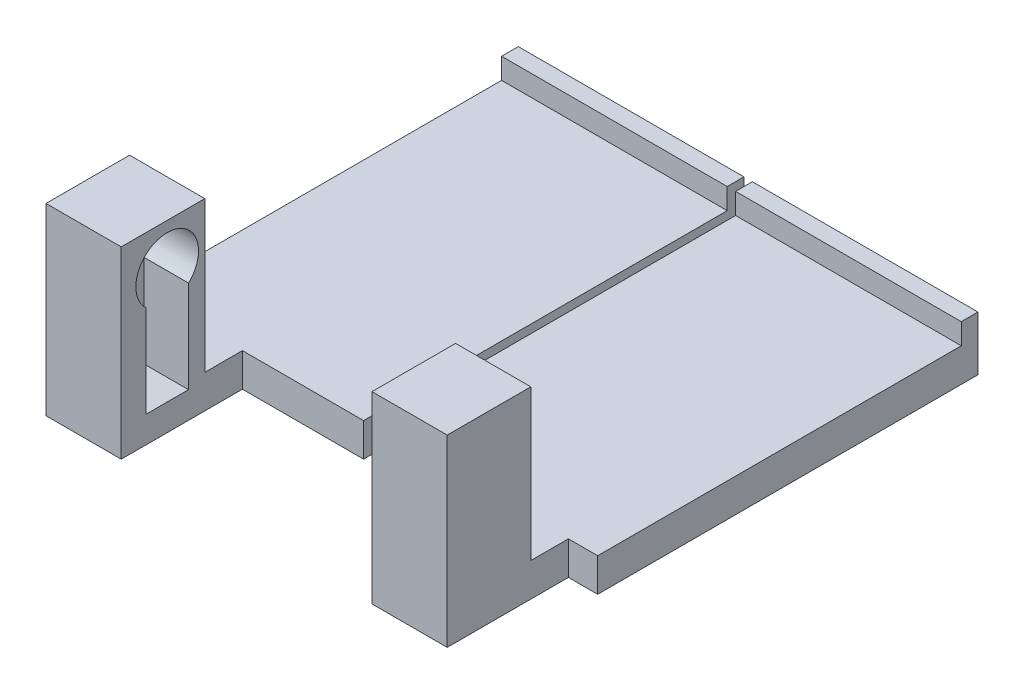
ISO-10303-21;
HEADER;
FILE_DESCRIPTION(('STEP AP214'),'2;1');
FILE_NAME('part.step','',(''),(''),'','','');
FILE_SCHEMA(('AUTOMOTIVE_DESIGN { 1 0 10303 214 1 1 1 1 }'));
ENDSEC;
DATA;
#1=APPLICATION_CONTEXT('core data for automotive mechanical design processes');
#2=APPLICATION_PROTOCOL_DEFINITION('international standard','automotive_design',2000,#1);
#3=PRODUCT_CONTEXT('',#1,'mechanical');
#4=PRODUCT('Part','Part','',(#3));
#5=PRODUCT_RELATED_PRODUCT_CATEGORY('part','',(#4));
#6=PRODUCT_DEFINITION_FORMATION('','',#4);
#7=PRODUCT_DEFINITION_CONTEXT('part definition',#1,'design');
#8=PRODUCT_DEFINITION('design','',#6,#7);
#9=PRODUCT_DEFINITION_SHAPE('','',#8);
#10=(LENGTH_UNIT() NAMED_UNIT(*) SI_UNIT(.MILLI.,.METRE.));
#11=(NAMED_UNIT(*) PLANE_ANGLE_UNIT() SI_UNIT($,.RADIAN.));
#12=(NAMED_UNIT(*) SI_UNIT($,.STERADIAN.) SOLID_ANGLE_UNIT());
#13=UNCERTAINTY_MEASURE_WITH_UNIT(LENGTH_MEASURE(1.E-05),#10,'distance_accuracy_value','');
#14=(GEOMETRIC_REPRESENTATION_CONTEXT(3) GLOBAL_UNCERTAINTY_ASSIGNED_CONTEXT((#13)) GLOBAL_UNIT_ASSIGNED_CONTEXT((#10,
#11,#12)) REPRESENTATION_CONTEXT('',''));
#15=CARTESIAN_POINT('',(0.,0.,0.));
#16=DIRECTION('',(0.,0.,1.));
#17=DIRECTION('',(1.,0.,0.));
#18=AXIS2_PLACEMENT_3D('',#15,#16,#17);
#19=CARTESIAN_POINT('',(-39.,-12.9782895512753,3.5));
#20=DIRECTION('',(0.,1.,0.));
#21=DIRECTION('',(0.,0.,1.));
#22=AXIS2_PLACEMENT_3D('',#19,#20,#21);
#23=PLANE('',#22);
#24=DIRECTION('',(0.,0.,-1.));
#25=VECTOR('',#24,1.);
#26=CARTESIAN_POINT('',(-42.5,-12.9782895512753,0.));
#27=LINE('',#26,#25);
#28=CARTESIAN_POINT('',(-42.5,-12.9782895512753,-11.));
#29=VERTEX_POINT('',#28);
#30=CARTESIAN_POINT('',(-42.5,-12.9782895512753,-54.5));
#31=VERTEX_POINT('',#30);
#32=EDGE_CURVE('E234',#29,#31,#27,.T.);
#33=ORIENTED_EDGE('',*,*,#32,.F.);
#34=DIRECTION('',(-1.,0.,0.));
#35=VECTOR('',#34,1.);
#36=CARTESIAN_POINT('',(-15.5,-12.9782895512753,-11.));
#37=LINE('',#36,#35);
#38=CARTESIAN_POINT('',(-39.,-12.9782895512753,-11.));
#39=VERTEX_POINT('',#38);
#40=EDGE_CURVE('E249',#39,#29,#37,.T.);
#41=ORIENTED_EDGE('',*,*,#40,.F.);
#42=DIRECTION('',(0.,0.,-1.));
#43=VECTOR('',#42,1.);
#44=CARTESIAN_POINT('',(-39.,-12.9782895512753,3.5));
#45=LINE('',#44,#43);
#46=CARTESIAN_POINT('',(-39.,-12.9782895512753,-6.5));
#47=VERTEX_POINT('',#46);
#48=EDGE_CURVE('E308',#47,#39,#45,.T.);
#49=ORIENTED_EDGE('',*,*,#48,.F.);
#50=DIRECTION('',(1.,0.,0.));
#51=VECTOR('',#50,1.);
#52=CARTESIAN_POINT('',(-39.,-12.9782895512753,-6.5));
#53=LINE('',#52,#51);
#54=CARTESIAN_POINT('',(-30.,-12.9782895512753,-6.5));
#55=VERTEX_POINT('',#54);
#56=EDGE_CURVE('E98',#47,#55,#53,.T.);
#57=ORIENTED_EDGE('',*,*,#56,.T.);
#58=DIRECTION('',(0.,0.,-1.));
#59=VECTOR('',#58,1.);
#60=CARTESIAN_POINT('',(-30.,-12.9782895512753,3.5));
#61=LINE('',#60,#59);
#62=CARTESIAN_POINT('',(-30.,-12.9782895512753,-11.));
#63=VERTEX_POINT('',#62);
#64=EDGE_CURVE('E286',#55,#63,#61,.T.);
#65=ORIENTED_EDGE('',*,*,#64,.T.);
#66=CARTESIAN_POINT('',(-15.5,-12.9782895512753,-11.));
#67=VERTEX_POINT('',#66);
#68=EDGE_CURVE('E245',#67,#63,#37,.T.);
#69=ORIENTED_EDGE('',*,*,#68,.F.);
#70=DIRECTION('',(0.,0.,-1.));
#71=VECTOR('',#70,1.);
#72=CARTESIAN_POINT('',(-15.5,-12.9782895512753,0.));
#73=LINE('',#72,#71);
#74=CARTESIAN_POINT('',(-15.5,-12.9782895512753,-54.5));
#75=VERTEX_POINT('',#74);
#76=EDGE_CURVE('E242',#67,#75,#73,.T.);
#77=ORIENTED_EDGE('',*,*,#76,.T.);
#78=DIRECTION('',(-1.,0.,0.));
#79=VECTOR('',#78,1.);
#80=CARTESIAN_POINT('',(-15.5,-12.9782895512753,-54.5));
#81=LINE('',#80,#79);
#82=EDGE_CURVE('E213',#75,#31,#81,.T.);
#83=ORIENTED_EDGE('',*,*,#82,.T.);
#84=EDGE_LOOP('',(#33,#41,#49,#57,#65,#69,#77,#83));
#85=FACE_BOUND('',#84,.T.);
#86=ADVANCED_FACE('F90',(#85),#23,.T.);
#87=CARTESIAN_POINT('',(-39.,0.,0.));
#88=DIRECTION('',(-1.,0.,0.));
#89=DIRECTION('',(0.,0.,-1.));
#90=AXIS2_PLACEMENT_3D('',#87,#88,#89);
#91=PLANE('',#90);
#92=DIRECTION('',(0.,0.,-1.));
#93=VECTOR('',#92,1.);
#94=CARTESIAN_POINT('',(-39.,5.02171044872466,3.5));
#95=LINE('',#94,#93);
#96=CARTESIAN_POINT('',(-39.,5.02171044872466,3.5));
#97=VERTEX_POINT('',#96);
#98=CARTESIAN_POINT('',(-39.,5.02171044872466,-6.5));
#99=VERTEX_POINT('',#98);
#100=EDGE_CURVE('E287',#97,#99,#95,.T.);
#101=ORIENTED_EDGE('',*,*,#100,.T.);
#102=DIRECTION('',(0.,1.,0.));
#103=VECTOR('',#102,1.);
#104=CARTESIAN_POINT('',(-39.,-12.9782895512753,-6.5));
#105=LINE('',#104,#103);
#106=EDGE_CURVE('E290',#47,#99,#105,.T.);
#107=ORIENTED_EDGE('',*,*,#106,.F.);
#108=ORIENTED_EDGE('',*,*,#48,.T.);
#109=DIRECTION('',(0.,1.,0.));
#110=VECTOR('',#109,1.);
#111=CARTESIAN_POINT('',(-39.,-16.9782895512753,-11.));
#112=LINE('',#111,#110);
#113=CARTESIAN_POINT('',(-39.,-16.9782895512753,-11.));
#114=VERTEX_POINT('',#113);
#115=EDGE_CURVE('E311',#114,#39,#112,.T.);
#116=ORIENTED_EDGE('',*,*,#115,.F.);
#117=DIRECTION('',(0.,0.,-1.));
#118=VECTOR('',#117,1.);
#119=CARTESIAN_POINT('',(-39.,-16.9782895512753,3.5));
#120=LINE('',#119,#118);
#121=CARTESIAN_POINT('',(-39.,-16.9782895512753,3.5));
#122=VERTEX_POINT('',#121);
#123=EDGE_CURVE('E314',#122,#114,#120,.T.);
#124=ORIENTED_EDGE('',*,*,#123,.F.);
#125=DIRECTION('',(0.,1.,0.));
#126=VECTOR('',#125,1.);
#127=CARTESIAN_POINT('',(-39.,-12.9782895512753,3.5));
#128=LINE('',#127,#126);
#129=EDGE_CURVE('E294',#122,#97,#128,.T.);
#130=ORIENTED_EDGE('',*,*,#129,.T.);
#131=EDGE_LOOP('',(#101,#107,#108,#116,#124,#130));
#132=FACE_BOUND('',#131,.T.);
#133=ADVANCED_FACE('F350',(#132),#91,.T.);
#134=CARTESIAN_POINT('',(-39.,5.02171044872466,3.5));
#135=DIRECTION('',(0.,1.,0.));
#136=DIRECTION('',(0.,0.,1.));
#137=AXIS2_PLACEMENT_3D('',#134,#135,#136);
#138=PLANE('',#137);
#139=DIRECTION('',(0.,0.,-1.));
#140=VECTOR('',#139,1.);
#141=CARTESIAN_POINT('',(-30.,5.02171044872466,3.5));
#142=LINE('',#141,#140);
#143=CARTESIAN_POINT('',(-30.,5.02171044872466,3.5));
#144=VERTEX_POINT('',#143);
#145=CARTESIAN_POINT('',(-30.,5.02171044872466,-6.5));
#146=VERTEX_POINT('',#145);
#147=EDGE_CURVE('E298',#144,#146,#142,.T.);
#148=ORIENTED_EDGE('',*,*,#147,.T.);
#149=DIRECTION('',(1.,0.,0.));
#150=VECTOR('',#149,1.);
#151=CARTESIAN_POINT('',(-39.,5.02171044872466,-6.5));
#152=LINE('',#151,#150);
#153=EDGE_CURVE('E297',#99,#146,#152,.T.);
#154=ORIENTED_EDGE('',*,*,#153,.F.);
#155=ORIENTED_EDGE('',*,*,#100,.F.);
#156=DIRECTION('',(1.,0.,0.));
#157=VECTOR('',#156,1.);
#158=CARTESIAN_POINT('',(-39.,5.02171044872466,3.5));
#159=LINE('',#158,#157);
#160=EDGE_CURVE('E13',#97,#144,#159,.T.);
#161=ORIENTED_EDGE('',*,*,#160,.T.);
#162=EDGE_LOOP('',(#148,#154,#155,#161));
#163=FACE_BOUND('',#162,.T.);
#164=ADVANCED_FACE('F345',(#163),#138,.T.);
#165=CARTESIAN_POINT('',(-30.,0.,0.));
#166=DIRECTION('',(-1.,0.,0.));
#167=DIRECTION('',(0.,0.,-1.));
#168=AXIS2_PLACEMENT_3D('',#165,#166,#167);
#169=PLANE('',#168);
#170=DIRECTION('',(0.,0.,1.));
#171=VECTOR('',#170,1.);
#172=CARTESIAN_POINT('',(-30.,-13.8,-4.55000000000001));
#173=LINE('',#172,#171);
#174=CARTESIAN_POINT('',(-30.,-13.8,-4.55000000000001));
#175=VERTEX_POINT('',#174);
#176=CARTESIAN_POINT('',(-30.,-13.8,0.549999999999994));
#177=VERTEX_POINT('',#176);
#178=EDGE_CURVE('E276',#175,#177,#173,.T.);
#179=ORIENTED_EDGE('',*,*,#178,.T.);
#180=DIRECTION('',(0.,-1.,0.));
#181=VECTOR('',#180,1.);
#182=CARTESIAN_POINT('',(-30.,0.,0.549999999999999));
#183=LINE('',#182,#181);
#184=CARTESIAN_POINT('',(-30.,-2.7495454169735,0.549999999999998));
#185=VERTEX_POINT('',#184);
#186=EDGE_CURVE('E248',#185,#177,#183,.T.);
#187=ORIENTED_EDGE('',*,*,#186,.F.);
#188=CARTESIAN_POINT('',(-30.,0.,-2.));
#189=DIRECTION('',(1.,0.,0.));
#190=DIRECTION('',(0.,0.,-1.));
#191=AXIS2_PLACEMENT_3D('',#188,#189,#190);
#192=CIRCLE('',#191,3.75);
#193=CARTESIAN_POINT('',(-30.,-2.7495454169735,-4.55));
#194=VERTEX_POINT('',#193);
#195=EDGE_CURVE('E259',#194,#185,#192,.T.);
#196=ORIENTED_EDGE('',*,*,#195,.F.);
#197=DIRECTION('',(0.,-1.,0.));
#198=VECTOR('',#197,1.);
#199=CARTESIAN_POINT('',(-30.,0.,-4.55));
#200=LINE('',#199,#198);
#201=EDGE_CURVE('E267',#194,#175,#200,.T.);
#202=ORIENTED_EDGE('',*,*,#201,.T.);
#203=EDGE_LOOP('',(#179,#187,#196,#202));
#204=FACE_BOUND('',#203,.T.);
#205=ORIENTED_EDGE('',*,*,#147,.F.);
#206=DIRECTION('',(0.,1.,0.));
#207=VECTOR('',#206,1.);
#208=CARTESIAN_POINT('',(-30.,-12.9782895512753,3.5));
#209=LINE('',#208,#207);
#210=CARTESIAN_POINT('',(-30.,-16.9782895512753,3.5));
#211=VERTEX_POINT('',#210);
#212=EDGE_CURVE('E291',#211,#144,#209,.T.);
#213=ORIENTED_EDGE('',*,*,#212,.F.);
#214=DIRECTION('',(0.,0.,-1.));
#215=VECTOR('',#214,1.);
#216=CARTESIAN_POINT('',(-30.,-16.9782895512753,3.5));
#217=LINE('',#216,#215);
#218=CARTESIAN_POINT('',(-30.,-16.9782895512753,-11.));
#219=VERTEX_POINT('',#218);
#220=EDGE_CURVE('E312',#211,#219,#217,.T.);
#221=ORIENTED_EDGE('',*,*,#220,.T.);
#222=DIRECTION('',(0.,1.,0.));
#223=VECTOR('',#222,1.);
#224=CARTESIAN_POINT('',(-30.,-16.9782895512753,-11.));
#225=LINE('',#224,#223);
#226=EDGE_CURVE('E319',#219,#63,#225,.T.);
#227=ORIENTED_EDGE('',*,*,#226,.T.);
#228=ORIENTED_EDGE('',*,*,#64,.F.);
#229=DIRECTION('',(0.,1.,0.));
#230=VECTOR('',#229,1.);
#231=CARTESIAN_POINT('',(-30.,-12.9782895512753,-6.5));
#232=LINE('',#231,#230);
#233=EDGE_CURVE('E301',#55,#146,#232,.T.);
#234=ORIENTED_EDGE('',*,*,#233,.T.);
#235=EDGE_LOOP('',(#205,#213,#221,#227,#228,#234));
#236=FACE_BOUND('',#235,.T.);
#237=ADVANCED_FACE('F325',(#204,#236),#169,.F.);
#238=CARTESIAN_POINT('',(-39.,-12.9782895512753,-6.5));
#239=DIRECTION('',(0.,0.,1.));
#240=DIRECTION('',(-1.,0.,0.));
#241=AXIS2_PLACEMENT_3D('',#238,#239,#240);
#242=PLANE('',#241);
#243=ORIENTED_EDGE('',*,*,#233,.F.);
#244=ORIENTED_EDGE('',*,*,#56,.F.);
#245=ORIENTED_EDGE('',*,*,#106,.T.);
#246=ORIENTED_EDGE('',*,*,#153,.T.);
#247=EDGE_LOOP('',(#243,#244,#245,#246));
#248=FACE_BOUND('',#247,.T.);
#249=ADVANCED_FACE('F342',(#248),#242,.F.);
#250=CARTESIAN_POINT('',(-39.,-12.9782895512753,3.5));
#251=DIRECTION('',(0.,0.,1.));
#252=DIRECTION('',(-1.,0.,0.));
#253=AXIS2_PLACEMENT_3D('',#250,#251,#252);
#254=PLANE('',#253);
#255=ORIENTED_EDGE('',*,*,#212,.T.);
#256=ORIENTED_EDGE('',*,*,#160,.F.);
#257=ORIENTED_EDGE('',*,*,#129,.F.);
#258=DIRECTION('',(1.,0.,0.));
#259=VECTOR('',#258,1.);
#260=CARTESIAN_POINT('',(-39.,-16.9782895512753,3.5));
#261=LINE('',#260,#259);
#262=EDGE_CURVE('E93',#122,#211,#261,.T.);
#263=ORIENTED_EDGE('',*,*,#262,.T.);
#264=EDGE_LOOP('',(#255,#256,#257,#263));
#265=FACE_BOUND('',#264,.T.);
#266=ADVANCED_FACE('F347',(#265),#254,.T.);
#267=CARTESIAN_POINT('',(-39.,-16.9782895512753,3.5));
#268=DIRECTION('',(0.,1.,0.));
#269=DIRECTION('',(0.,0.,1.));
#270=AXIS2_PLACEMENT_3D('',#267,#268,#269);
#271=PLANE('',#270);
#272=ORIENTED_EDGE('',*,*,#220,.F.);
#273=ORIENTED_EDGE('',*,*,#262,.F.);
#274=ORIENTED_EDGE('',*,*,#123,.T.);
#275=DIRECTION('',(-1.,0.,0.));
#276=VECTOR('',#275,1.);
#277=CARTESIAN_POINT('',(-15.5,-16.9782895512753,-11.));
#278=LINE('',#277,#276);
#279=CARTESIAN_POINT('',(-42.5,-16.9782895512753,-11.));
#280=VERTEX_POINT('',#279);
#281=EDGE_CURVE('E244',#114,#280,#278,.T.);
#282=ORIENTED_EDGE('',*,*,#281,.T.);
#283=DIRECTION('',(0.,0.,-1.));
#284=VECTOR('',#283,1.);
#285=CARTESIAN_POINT('',(-42.5,-16.9782895512753,0.));
#286=LINE('',#285,#284);
#287=CARTESIAN_POINT('',(-42.5,-16.9782895512753,-56.5));
#288=VERTEX_POINT('',#287);
#289=EDGE_CURVE('E229',#280,#288,#286,.T.);
#290=ORIENTED_EDGE('',*,*,#289,.T.);
#291=DIRECTION('',(-1.,0.,0.));
#292=VECTOR('',#291,1.);
#293=CARTESIAN_POINT('',(-15.5,-16.9782895512753,-56.5));
#294=LINE('',#293,#292);
#295=CARTESIAN_POINT('',(-15.5,-16.9782895512753,-56.5));
#296=VERTEX_POINT('',#295);
#297=EDGE_CURVE('E250',#296,#288,#294,.T.);
#298=ORIENTED_EDGE('',*,*,#297,.F.);
#299=DIRECTION('',(0.,0.,-1.));
#300=VECTOR('',#299,1.);
#301=CARTESIAN_POINT('',(-15.5,-16.9782895512753,0.));
#302=LINE('',#301,#300);
#303=CARTESIAN_POINT('',(-15.5,-16.9782895512753,-11.));
#304=VERTEX_POINT('',#303);
#305=EDGE_CURVE('E239',#304,#296,#302,.T.);
#306=ORIENTED_EDGE('',*,*,#305,.F.);
#307=EDGE_CURVE('E253',#304,#219,#278,.T.);
#308=ORIENTED_EDGE('',*,*,#307,.T.);
#309=EDGE_LOOP('',(#272,#273,#274,#282,#290,#298,#306,#308));
#310=FACE_BOUND('',#309,.T.);
#311=ADVANCED_FACE('F329',(#310),#271,.F.);
#312=CARTESIAN_POINT('',(-35.3,0.,-2.));
#313=DIRECTION('',(-1.,0.,0.));
#314=DIRECTION('',(0.,0.,-1.));
#315=AXIS2_PLACEMENT_3D('',#312,#313,#314);
#316=PLANE('',#315);
#317=CARTESIAN_POINT('',(-35.3,0.,-2.));
#318=DIRECTION('',(1.,0.,0.));
#319=DIRECTION('',(0.,0.,-1.));
#320=AXIS2_PLACEMENT_3D('',#317,#318,#319);
#321=CIRCLE('',#320,3.75);
#322=CARTESIAN_POINT('',(-35.3,-2.7495454169735,-4.55));
#323=VERTEX_POINT('',#322);
#324=CARTESIAN_POINT('',(-35.3,-2.7495454169735,0.549999999999998));
#325=VERTEX_POINT('',#324);
#326=EDGE_CURVE('E255',#323,#325,#321,.T.);
#327=ORIENTED_EDGE('',*,*,#326,.T.);
#328=DIRECTION('',(0.,-1.,0.));
#329=VECTOR('',#328,1.);
#330=CARTESIAN_POINT('',(-35.3,0.,0.549999999999999));
#331=LINE('',#330,#329);
#332=CARTESIAN_POINT('',(-35.3,-13.8,0.549999999999994));
#333=VERTEX_POINT('',#332);
#334=EDGE_CURVE('E263',#325,#333,#331,.T.);
#335=ORIENTED_EDGE('',*,*,#334,.T.);
#336=DIRECTION('',(0.,0.,1.));
#337=VECTOR('',#336,1.);
#338=CARTESIAN_POINT('',(-35.3,-13.8,-4.55000000000001));
#339=LINE('',#338,#337);
#340=CARTESIAN_POINT('',(-35.3,-13.8,-4.55000000000001));
#341=VERTEX_POINT('',#340);
#342=EDGE_CURVE('E266',#341,#333,#339,.T.);
#343=ORIENTED_EDGE('',*,*,#342,.F.);
#344=DIRECTION('',(0.,-1.,0.));
#345=VECTOR('',#344,1.);
#346=CARTESIAN_POINT('',(-35.3,0.,-4.55));
#347=LINE('',#346,#345);
#348=EDGE_CURVE('E270',#323,#341,#347,.T.);
#349=ORIENTED_EDGE('',*,*,#348,.F.);
#350=EDGE_LOOP('',(#327,#335,#343,#349));
#351=FACE_BOUND('',#350,.T.);
#352=ADVANCED_FACE('F391',(#351),#316,.F.);
#353=CARTESIAN_POINT('',(-35.3,0.,-2.));
#354=DIRECTION('',(1.,0.,0.));
#355=DIRECTION('',(0.,0.,1.));
#356=AXIS2_PLACEMENT_3D('',#353,#354,#355);
#357=CYLINDRICAL_SURFACE('',#356,3.75);
#358=DIRECTION('',(1.,0.,0.));
#359=VECTOR('',#358,1.);
#360=CARTESIAN_POINT('',(-35.3,-2.7495454169735,0.549999999999998));
#361=LINE('',#360,#359);
#362=EDGE_CURVE('E284',#325,#185,#361,.T.);
#363=ORIENTED_EDGE('',*,*,#362,.F.);
#364=ORIENTED_EDGE('',*,*,#326,.F.);
#365=DIRECTION('',(1.,0.,0.));
#366=VECTOR('',#365,1.);
#367=CARTESIAN_POINT('',(-35.3,-2.7495454169735,-4.55));
#368=LINE('',#367,#366);
#369=EDGE_CURVE('E258',#323,#194,#368,.T.);
#370=ORIENTED_EDGE('',*,*,#369,.T.);
#371=ORIENTED_EDGE('',*,*,#195,.T.);
#372=EDGE_LOOP('',(#363,#364,#370,#371));
#373=FACE_BOUND('',#372,.T.);
#374=ADVANCED_FACE('F395',(#373),#357,.F.);
#375=CARTESIAN_POINT('',(-35.3,-13.8,-4.55000000000001));
#376=DIRECTION('',(0.,-1.,0.));
#377=DIRECTION('',(0.,0.,-1.));
#378=AXIS2_PLACEMENT_3D('',#375,#376,#377);
#379=PLANE('',#378);
#380=ORIENTED_EDGE('',*,*,#178,.F.);
#381=DIRECTION('',(1.,0.,0.));
#382=VECTOR('',#381,1.);
#383=CARTESIAN_POINT('',(-35.3,-13.8,-4.55000000000001));
#384=LINE('',#383,#382);
#385=EDGE_CURVE('E273',#341,#175,#384,.T.);
#386=ORIENTED_EDGE('',*,*,#385,.F.);
#387=ORIENTED_EDGE('',*,*,#342,.T.);
#388=DIRECTION('',(1.,0.,0.));
#389=VECTOR('',#388,1.);
#390=CARTESIAN_POINT('',(-35.3,-13.8,0.549999999999994));
#391=LINE('',#390,#389);
#392=EDGE_CURVE('E262',#333,#177,#391,.T.);
#393=ORIENTED_EDGE('',*,*,#392,.T.);
#394=EDGE_LOOP('',(#380,#386,#387,#393));
#395=FACE_BOUND('',#394,.T.);
#396=ADVANCED_FACE('F401',(#395),#379,.F.);
#397=CARTESIAN_POINT('',(-35.3,0.,-4.55));
#398=DIRECTION('',(0.,0.,-1.));
#399=DIRECTION('',(0.,1.,0.));
#400=AXIS2_PLACEMENT_3D('',#397,#398,#399);
#401=PLANE('',#400);
#402=ORIENTED_EDGE('',*,*,#369,.F.);
#403=ORIENTED_EDGE('',*,*,#348,.T.);
#404=ORIENTED_EDGE('',*,*,#385,.T.);
#405=ORIENTED_EDGE('',*,*,#201,.F.);
#406=EDGE_LOOP('',(#402,#403,#404,#405));
#407=FACE_BOUND('',#406,.T.);
#408=ADVANCED_FACE('F405',(#407),#401,.F.);
#409=CARTESIAN_POINT('',(-35.3,0.,0.549999999999999));
#410=DIRECTION('',(0.,0.,-1.));
#411=DIRECTION('',(0.,1.,0.));
#412=AXIS2_PLACEMENT_3D('',#409,#410,#411);
#413=PLANE('',#412);
#414=ORIENTED_EDGE('',*,*,#334,.F.);
#415=ORIENTED_EDGE('',*,*,#362,.T.);
#416=ORIENTED_EDGE('',*,*,#186,.T.);
#417=ORIENTED_EDGE('',*,*,#392,.F.);
#418=EDGE_LOOP('',(#414,#415,#416,#417));
#419=FACE_BOUND('',#418,.T.);
#420=ADVANCED_FACE('F382',(#419),#413,.T.);
#421=CARTESIAN_POINT('',(-15.5,0.,-11.));
#422=DIRECTION('',(0.,0.,-1.));
#423=DIRECTION('',(0.,1.,0.));
#424=AXIS2_PLACEMENT_3D('',#421,#422,#423);
#425=PLANE('',#424);
#426=ORIENTED_EDGE('',*,*,#307,.F.);
#427=DIRECTION('',(0.,1.,0.));
#428=VECTOR('',#427,1.);
#429=CARTESIAN_POINT('',(-15.5,0.,-11.));
#430=LINE('',#429,#428);
#431=EDGE_CURVE('E237',#304,#67,#430,.T.);
#432=ORIENTED_EDGE('',*,*,#431,.T.);
#433=ORIENTED_EDGE('',*,*,#68,.T.);
#434=ORIENTED_EDGE('',*,*,#226,.F.);
#435=EDGE_LOOP('',(#426,#432,#433,#434));
#436=FACE_BOUND('',#435,.T.);
#437=ADVANCED_FACE('F335',(#436),#425,.F.);
#438=ORIENTED_EDGE('',*,*,#115,.T.);
#439=ORIENTED_EDGE('',*,*,#40,.T.);
#440=DIRECTION('',(0.,1.,0.));
#441=VECTOR('',#440,1.);
#442=CARTESIAN_POINT('',(-42.5,0.,-11.));
#443=LINE('',#442,#441);
#444=EDGE_CURVE('E215',#280,#29,#443,.T.);
#445=ORIENTED_EDGE('',*,*,#444,.F.);
#446=ORIENTED_EDGE('',*,*,#281,.F.);
#447=EDGE_LOOP('',(#438,#439,#445,#446));
#448=FACE_BOUND('',#447,.T.);
#449=ADVANCED_FACE('F355',(#448),#425,.F.);
#450=CARTESIAN_POINT('',(-15.5,0.,-56.5));
#451=DIRECTION('',(0.,0.,1.));
#452=DIRECTION('',(-1.,0.,0.));
#453=AXIS2_PLACEMENT_3D('',#450,#451,#452);
#454=PLANE('',#453);
#455=DIRECTION('',(0.,-1.,0.));
#456=VECTOR('',#455,1.);
#457=CARTESIAN_POINT('',(-15.5,0.,-56.5));
#458=LINE('',#457,#456);
#459=CARTESIAN_POINT('',(-15.5,-10.4782895512753,-56.5));
#460=VERTEX_POINT('',#459);
#461=EDGE_CURVE('E220',#460,#296,#458,.T.);
#462=ORIENTED_EDGE('',*,*,#461,.T.);
#463=ORIENTED_EDGE('',*,*,#297,.T.);
#464=DIRECTION('',(0.,-1.,0.));
#465=VECTOR('',#464,1.);
#466=CARTESIAN_POINT('',(-42.5,0.,-56.5));
#467=LINE('',#466,#465);
#468=CARTESIAN_POINT('',(-42.5,-10.4782895512753,-56.5));
#469=VERTEX_POINT('',#468);
#470=EDGE_CURVE('E232',#469,#288,#467,.T.);
#471=ORIENTED_EDGE('',*,*,#470,.F.);
#472=DIRECTION('',(1.,0.,0.));
#473=VECTOR('',#472,1.);
#474=CARTESIAN_POINT('',(-15.5,-10.4782895512753,-56.5));
#475=LINE('',#474,#473);
#476=EDGE_CURVE('E225',#469,#460,#475,.T.);
#477=ORIENTED_EDGE('',*,*,#476,.T.);
#478=EDGE_LOOP('',(#462,#463,#471,#477));
#479=FACE_BOUND('',#478,.T.);
#480=ADVANCED_FACE('F362',(#479),#454,.F.);
#481=CARTESIAN_POINT('',(-15.5,0.,0.));
#482=DIRECTION('',(-1.,0.,0.));
#483=DIRECTION('',(0.,0.,-1.));
#484=AXIS2_PLACEMENT_3D('',#481,#482,#483);
#485=PLANE('',#484);
#486=ORIENTED_EDGE('',*,*,#431,.F.);
#487=ORIENTED_EDGE('',*,*,#305,.T.);
#488=ORIENTED_EDGE('',*,*,#461,.F.);
#489=DIRECTION('',(0.,0.,1.));
#490=VECTOR('',#489,1.);
#491=CARTESIAN_POINT('',(-15.5,-10.4782895512753,-56.5));
#492=LINE('',#491,#490);
#493=CARTESIAN_POINT('',(-15.5,-10.4782895512753,-54.5));
#494=VERTEX_POINT('',#493);
#495=EDGE_CURVE('E208',#460,#494,#492,.T.);
#496=ORIENTED_EDGE('',*,*,#495,.T.);
#497=DIRECTION('',(0.,-1.,0.));
#498=VECTOR('',#497,1.);
#499=CARTESIAN_POINT('',(-15.5,-10.4782895512753,-54.5));
#500=LINE('',#499,#498);
#501=EDGE_CURVE('E106',#494,#75,#500,.T.);
#502=ORIENTED_EDGE('',*,*,#501,.T.);
#503=ORIENTED_EDGE('',*,*,#76,.F.);
#504=EDGE_LOOP('',(#486,#487,#488,#496,#502,#503));
#505=FACE_BOUND('',#504,.T.);
#506=ADVANCED_FACE('F218',(#505),#485,.F.);
#507=CARTESIAN_POINT('',(-42.5,0.,0.));
#508=DIRECTION('',(-1.,0.,0.));
#509=DIRECTION('',(0.,0.,-1.));
#510=AXIS2_PLACEMENT_3D('',#507,#508,#509);
#511=PLANE('',#510);
#512=ORIENTED_EDGE('',*,*,#444,.T.);
#513=ORIENTED_EDGE('',*,*,#32,.T.);
#514=DIRECTION('',(0.,-1.,0.));
#515=VECTOR('',#514,1.);
#516=CARTESIAN_POINT('',(-42.5,-10.4782895512753,-54.5));
#517=LINE('',#516,#515);
#518=CARTESIAN_POINT('',(-42.5,-10.4782895512753,-54.5));
#519=VERTEX_POINT('',#518);
#520=EDGE_CURVE('E113',#519,#31,#517,.T.);
#521=ORIENTED_EDGE('',*,*,#520,.F.);
#522=DIRECTION('',(0.,0.,-1.));
#523=VECTOR('',#522,1.);
#524=CARTESIAN_POINT('',(-42.5,-10.4782895512753,-56.5));
#525=LINE('',#524,#523);
#526=EDGE_CURVE('E210',#519,#469,#525,.T.);
#527=ORIENTED_EDGE('',*,*,#526,.T.);
#528=ORIENTED_EDGE('',*,*,#470,.T.);
#529=ORIENTED_EDGE('',*,*,#289,.F.);
#530=EDGE_LOOP('',(#512,#513,#521,#527,#528,#529));
#531=FACE_BOUND('',#530,.T.);
#532=ADVANCED_FACE('F359',(#531),#511,.T.);
#533=CARTESIAN_POINT('',(-15.5,-10.4782895512753,-54.5));
#534=DIRECTION('',(0.,0.,-1.));
#535=DIRECTION('',(0.,1.,0.));
#536=AXIS2_PLACEMENT_3D('',#533,#534,#535);
#537=PLANE('',#536);
#538=ORIENTED_EDGE('',*,*,#82,.F.);
#539=ORIENTED_EDGE('',*,*,#501,.F.);
#540=DIRECTION('',(-1.,0.,0.));
#541=VECTOR('',#540,1.);
#542=CARTESIAN_POINT('',(-15.5,-10.4782895512753,-54.5));
#543=LINE('',#542,#541);
#544=EDGE_CURVE('E205',#494,#519,#543,.T.);
#545=ORIENTED_EDGE('',*,*,#544,.T.);
#546=ORIENTED_EDGE('',*,*,#520,.T.);
#547=EDGE_LOOP('',(#538,#539,#545,#546));
#548=FACE_BOUND('',#547,.T.);
#549=ADVANCED_FACE('F212',(#548),#537,.F.);
#550=CARTESIAN_POINT('',(-30.,-10.4782895512753,0.));
#551=DIRECTION('',(0.,1.,0.));
#552=DIRECTION('',(0.,0.,1.));
#553=AXIS2_PLACEMENT_3D('',#550,#551,#552);
#554=PLANE('',#553);
#555=ORIENTED_EDGE('',*,*,#495,.F.);
#556=ORIENTED_EDGE('',*,*,#476,.F.);
#557=ORIENTED_EDGE('',*,*,#526,.F.);
#558=ORIENTED_EDGE('',*,*,#544,.F.);
#559=EDGE_LOOP('',(#555,#556,#557,#558));
#560=FACE_BOUND('',#559,.T.);
#561=ADVANCED_FACE('F206',(#560),#554,.T.);
#562=CLOSED_SHELL('',(#86,#133,#164,#237,#249,#266,#311,#352,#374,#396,#408,#420,#437,#449,#480,
#506,#532,#549,#561));
#563=MANIFOLD_SOLID_BREP('B2',#562);
#564=CARTESIAN_POINT('',(9.,-12.9782895512753,3.5));
#565=DIRECTION('',(0.,1.,0.));
#566=DIRECTION('',(0.,0.,1.));
#567=AXIS2_PLACEMENT_3D('',#564,#565,#566);
#568=PLANE('',#567);
#569=DIRECTION('',(0.,0.,-1.));
#570=VECTOR('',#569,1.);
#571=CARTESIAN_POINT('',(12.5,-12.9782895512753,0.));
#572=LINE('',#571,#570);
#573=CARTESIAN_POINT('',(12.5,-12.9782895512753,-11.));
#574=VERTEX_POINT('',#573);
#575=CARTESIAN_POINT('',(12.5,-12.9782895512753,-54.5));
#576=VERTEX_POINT('',#575);
#577=EDGE_CURVE('E573',#574,#576,#572,.T.);
#578=ORIENTED_EDGE('',*,*,#577,.T.);
#579=DIRECTION('',(1.,0.,0.));
#580=VECTOR('',#579,1.);
#581=CARTESIAN_POINT('',(-14.5,-12.9782895512753,-54.5));
#582=LINE('',#581,#580);
#583=CARTESIAN_POINT('',(-14.5,-12.9782895512753,-54.5));
#584=VERTEX_POINT('',#583);
#585=EDGE_CURVE('E568',#584,#576,#582,.T.);
#586=ORIENTED_EDGE('',*,*,#585,.F.);
#587=DIRECTION('',(0.,0.,-1.));
#588=VECTOR('',#587,1.);
#589=CARTESIAN_POINT('',(-14.5,-12.9782895512753,0.));
#590=LINE('',#589,#588);
#591=CARTESIAN_POINT('',(-14.5,-12.9782895512753,-11.));
#592=VERTEX_POINT('',#591);
#593=EDGE_CURVE('E685',#592,#584,#590,.T.);
#594=ORIENTED_EDGE('',*,*,#593,.F.);
#595=DIRECTION('',(1.,0.,0.));
#596=VECTOR('',#595,1.);
#597=CARTESIAN_POINT('',(-14.5,-12.9782895512753,-11.));
#598=LINE('',#597,#596);
#599=CARTESIAN_POINT('',(0.,-12.9782895512753,-11.));
#600=VERTEX_POINT('',#599);
#601=EDGE_CURVE('E709',#592,#600,#598,.T.);
#602=ORIENTED_EDGE('',*,*,#601,.T.);
#603=DIRECTION('',(0.,0.,-1.));
#604=VECTOR('',#603,1.);
#605=CARTESIAN_POINT('',(0.,-12.9782895512753,3.5));
#606=LINE('',#605,#604);
#607=CARTESIAN_POINT('',(0.,-12.9782895512753,-6.5));
#608=VERTEX_POINT('',#607);
#609=EDGE_CURVE('E747',#608,#600,#606,.T.);
#610=ORIENTED_EDGE('',*,*,#609,.F.);
#611=DIRECTION('',(-1.,0.,0.));
#612=VECTOR('',#611,1.);
#613=CARTESIAN_POINT('',(9.,-12.9782895512753,-6.5));
#614=LINE('',#613,#612);
#615=CARTESIAN_POINT('',(9.,-12.9782895512753,-6.5));
#616=VERTEX_POINT('',#615);
#617=EDGE_CURVE('E560',#616,#608,#614,.T.);
#618=ORIENTED_EDGE('',*,*,#617,.F.);
#619=DIRECTION('',(0.,0.,-1.));
#620=VECTOR('',#619,1.);
#621=CARTESIAN_POINT('',(9.,-12.9782895512753,3.5));
#622=LINE('',#621,#620);
#623=CARTESIAN_POINT('',(9.,-12.9782895512753,-11.));
#624=VERTEX_POINT('',#623);
#625=EDGE_CURVE('E768',#616,#624,#622,.T.);
#626=ORIENTED_EDGE('',*,*,#625,.T.);
#627=EDGE_CURVE('E713',#624,#574,#598,.T.);
#628=ORIENTED_EDGE('',*,*,#627,.T.);
#629=EDGE_LOOP('',(#578,#586,#594,#602,#610,#618,#626,#628));
#630=FACE_BOUND('',#629,.T.);
#631=ADVANCED_FACE('F552',(#630),#568,.T.);
#632=CARTESIAN_POINT('',(9.,0.,0.));
#633=DIRECTION('',(1.,0.,0.));
#634=DIRECTION('',(0.,0.,-1.));
#635=AXIS2_PLACEMENT_3D('',#632,#633,#634);
#636=PLANE('',#635);
#637=DIRECTION('',(0.,0.,-1.));
#638=VECTOR('',#637,1.);
#639=CARTESIAN_POINT('',(9.,5.02171044872466,3.5));
#640=LINE('',#639,#638);
#641=CARTESIAN_POINT('',(9.,5.02171044872466,3.5));
#642=VERTEX_POINT('',#641);
#643=CARTESIAN_POINT('',(9.,5.02171044872466,-6.5));
#644=VERTEX_POINT('',#643);
#645=EDGE_CURVE('E748',#642,#644,#640,.T.);
#646=ORIENTED_EDGE('',*,*,#645,.F.);
#647=DIRECTION('',(0.,1.,0.));
#648=VECTOR('',#647,1.);
#649=CARTESIAN_POINT('',(9.,-12.9782895512753,3.5));
#650=LINE('',#649,#648);
#651=CARTESIAN_POINT('',(9.,-16.9782895512753,3.5));
#652=VERTEX_POINT('',#651);
#653=EDGE_CURVE('E754',#652,#642,#650,.T.);
#654=ORIENTED_EDGE('',*,*,#653,.F.);
#655=DIRECTION('',(0.,0.,-1.));
#656=VECTOR('',#655,1.);
#657=CARTESIAN_POINT('',(9.,-16.9782895512753,3.5));
#658=LINE('',#657,#656);
#659=CARTESIAN_POINT('',(8.99999999999999,-16.9782895512753,-11.));
#660=VERTEX_POINT('',#659);
#661=EDGE_CURVE('E775',#652,#660,#658,.T.);
#662=ORIENTED_EDGE('',*,*,#661,.T.);
#663=DIRECTION('',(0.,1.,0.));
#664=VECTOR('',#663,1.);
#665=CARTESIAN_POINT('',(9.,-16.9782895512753,-11.));
#666=LINE('',#665,#664);
#667=EDGE_CURVE('E771',#660,#624,#666,.T.);
#668=ORIENTED_EDGE('',*,*,#667,.T.);
#669=ORIENTED_EDGE('',*,*,#625,.F.);
#670=DIRECTION('',(0.,1.,0.));
#671=VECTOR('',#670,1.);
#672=CARTESIAN_POINT('',(9.,-12.9782895512753,-6.5));
#673=LINE('',#672,#671);
#674=EDGE_CURVE('E751',#616,#644,#673,.T.);
#675=ORIENTED_EDGE('',*,*,#674,.T.);
#676=EDGE_LOOP('',(#646,#654,#662,#668,#669,#675));
#677=FACE_BOUND('',#676,.T.);
#678=ADVANCED_FACE('F819',(#677),#636,.T.);
#679=CARTESIAN_POINT('',(9.,5.02171044872466,3.5));
#680=DIRECTION('',(0.,1.,0.));
#681=DIRECTION('',(0.,0.,1.));
#682=AXIS2_PLACEMENT_3D('',#679,#680,#681);
#683=PLANE('',#682);
#684=DIRECTION('',(0.,0.,-1.));
#685=VECTOR('',#684,1.);
#686=CARTESIAN_POINT('',(0.,5.02171044872466,3.5));
#687=LINE('',#686,#685);
#688=CARTESIAN_POINT('',(0.,5.02171044872466,3.5));
#689=VERTEX_POINT('',#688);
#690=CARTESIAN_POINT('',(0.,5.02171044872466,-6.5));
#691=VERTEX_POINT('',#690);
#692=EDGE_CURVE('E758',#689,#691,#687,.T.);
#693=ORIENTED_EDGE('',*,*,#692,.F.);
#694=DIRECTION('',(-1.,0.,0.));
#695=VECTOR('',#694,1.);
#696=CARTESIAN_POINT('',(9.,5.02171044872466,3.5));
#697=LINE('',#696,#695);
#698=EDGE_CURVE('E88',#642,#689,#697,.T.);
#699=ORIENTED_EDGE('',*,*,#698,.F.);
#700=ORIENTED_EDGE('',*,*,#645,.T.);
#701=DIRECTION('',(-1.,0.,0.));
#702=VECTOR('',#701,1.);
#703=CARTESIAN_POINT('',(9.,5.02171044872466,-6.5));
#704=LINE('',#703,#702);
#705=EDGE_CURVE('E757',#644,#691,#704,.T.);
#706=ORIENTED_EDGE('',*,*,#705,.T.);
#707=EDGE_LOOP('',(#693,#699,#700,#706));
#708=FACE_BOUND('',#707,.T.);
#709=ADVANCED_FACE('F823',(#708),#683,.T.);
#710=CARTESIAN_POINT('',(0.,0.,0.));
#711=DIRECTION('',(1.,0.,0.));
#712=DIRECTION('',(0.,0.,-1.));
#713=AXIS2_PLACEMENT_3D('',#710,#711,#712);
#714=PLANE('',#713);
#715=DIRECTION('',(0.,0.,1.));
#716=VECTOR('',#715,1.);
#717=CARTESIAN_POINT('',(0.,-13.8,-4.55000000000001));
#718=LINE('',#717,#716);
#719=CARTESIAN_POINT('',(0.,-13.8,-4.55000000000001));
#720=VERTEX_POINT('',#719);
#721=CARTESIAN_POINT('',(0.,-13.8,0.549999999999994));
#722=VERTEX_POINT('',#721);
#723=EDGE_CURVE('E737',#720,#722,#718,.T.);
#724=ORIENTED_EDGE('',*,*,#723,.F.);
#725=DIRECTION('',(0.,-1.,0.));
#726=VECTOR('',#725,1.);
#727=CARTESIAN_POINT('',(0.,0.,-4.55));
#728=LINE('',#727,#726);
#729=CARTESIAN_POINT('',(0.,-2.7495454169735,-4.55));
#730=VERTEX_POINT('',#729);
#731=EDGE_CURVE('E729',#730,#720,#728,.T.);
#732=ORIENTED_EDGE('',*,*,#731,.F.);
#733=CARTESIAN_POINT('',(0.,0.,-2.));
#734=DIRECTION('',(1.,0.,0.));
#735=DIRECTION('',(0.,0.,-1.));
#736=AXIS2_PLACEMENT_3D('',#733,#734,#735);
#737=CIRCLE('',#736,3.75);
#738=CARTESIAN_POINT('',(0.,-2.7495454169735,0.549999999999998));
#739=VERTEX_POINT('',#738);
#740=EDGE_CURVE('E722',#730,#739,#737,.T.);
#741=ORIENTED_EDGE('',*,*,#740,.T.);
#742=DIRECTION('',(0.,-1.,0.));
#743=VECTOR('',#742,1.);
#744=CARTESIAN_POINT('',(0.,0.,0.549999999999999));
#745=LINE('',#744,#743);
#746=EDGE_CURVE('E712',#739,#722,#745,.T.);
#747=ORIENTED_EDGE('',*,*,#746,.T.);
#748=EDGE_LOOP('',(#724,#732,#741,#747));
#749=FACE_BOUND('',#748,.T.);
#750=ORIENTED_EDGE('',*,*,#692,.T.);
#751=DIRECTION('',(0.,1.,0.));
#752=VECTOR('',#751,1.);
#753=CARTESIAN_POINT('',(0.,-12.9782895512753,-6.5));
#754=LINE('',#753,#752);
#755=EDGE_CURVE('E761',#608,#691,#754,.T.);
#756=ORIENTED_EDGE('',*,*,#755,.F.);
#757=ORIENTED_EDGE('',*,*,#609,.T.);
#758=DIRECTION('',(0.,1.,0.));
#759=VECTOR('',#758,1.);
#760=CARTESIAN_POINT('',(0.,-16.9782895512753,-11.));
#761=LINE('',#760,#759);
#762=CARTESIAN_POINT('',(0.,-16.9782895512753,-11.));
#763=VERTEX_POINT('',#762);
#764=EDGE_CURVE('E780',#763,#600,#761,.T.);
#765=ORIENTED_EDGE('',*,*,#764,.F.);
#766=DIRECTION('',(0.,0.,-1.));
#767=VECTOR('',#766,1.);
#768=CARTESIAN_POINT('',(0.,-16.9782895512753,3.5));
#769=LINE('',#768,#767);
#770=CARTESIAN_POINT('',(0.,-16.9782895512753,3.5));
#771=VERTEX_POINT('',#770);
#772=EDGE_CURVE('E772',#771,#763,#769,.T.);
#773=ORIENTED_EDGE('',*,*,#772,.F.);
#774=DIRECTION('',(0.,1.,0.));
#775=VECTOR('',#774,1.);
#776=CARTESIAN_POINT('',(0.,-12.9782895512753,3.5));
#777=LINE('',#776,#775);
#778=EDGE_CURVE('E752',#771,#689,#777,.T.);
#779=ORIENTED_EDGE('',*,*,#778,.T.);
#780=EDGE_LOOP('',(#750,#756,#757,#765,#773,#779));
#781=FACE_BOUND('',#780,.T.);
#782=ADVANCED_FACE('F791',(#749,#781),#714,.F.);
#783=CARTESIAN_POINT('',(9.,-12.9782895512753,-6.5));
#784=DIRECTION('',(0.,0.,1.));
#785=DIRECTION('',(1.,0.,0.));
#786=AXIS2_PLACEMENT_3D('',#783,#784,#785);
#787=PLANE('',#786);
#788=ORIENTED_EDGE('',*,*,#755,.T.);
#789=ORIENTED_EDGE('',*,*,#705,.F.);
#790=ORIENTED_EDGE('',*,*,#674,.F.);
#791=ORIENTED_EDGE('',*,*,#617,.T.);
#792=EDGE_LOOP('',(#788,#789,#790,#791));
#793=FACE_BOUND('',#792,.T.);
#794=ADVANCED_FACE('F839',(#793),#787,.F.);
#795=CARTESIAN_POINT('',(9.,-12.9782895512753,3.5));
#796=DIRECTION('',(0.,0.,1.));
#797=DIRECTION('',(1.,0.,0.));
#798=AXIS2_PLACEMENT_3D('',#795,#796,#797);
#799=PLANE('',#798);
#800=ORIENTED_EDGE('',*,*,#778,.F.);
#801=DIRECTION('',(-1.,0.,0.));
#802=VECTOR('',#801,1.);
#803=CARTESIAN_POINT('',(9.,-16.9782895512753,3.5));
#804=LINE('',#803,#802);
#805=EDGE_CURVE('E555',#652,#771,#804,.T.);
#806=ORIENTED_EDGE('',*,*,#805,.F.);
#807=ORIENTED_EDGE('',*,*,#653,.T.);
#808=ORIENTED_EDGE('',*,*,#698,.T.);
#809=EDGE_LOOP('',(#800,#806,#807,#808));
#810=FACE_BOUND('',#809,.T.);
#811=ADVANCED_FACE('F841',(#810),#799,.T.);
#812=CARTESIAN_POINT('',(9.,-16.9782895512753,3.5));
#813=DIRECTION('',(0.,1.,0.));
#814=DIRECTION('',(0.,0.,1.));
#815=AXIS2_PLACEMENT_3D('',#812,#813,#814);
#816=PLANE('',#815);
#817=ORIENTED_EDGE('',*,*,#772,.T.);
#818=DIRECTION('',(1.,0.,0.));
#819=VECTOR('',#818,1.);
#820=CARTESIAN_POINT('',(-14.5,-16.9782895512753,-11.));
#821=LINE('',#820,#819);
#822=CARTESIAN_POINT('',(-14.5,-16.9782895512753,-11.));
#823=VERTEX_POINT('',#822);
#824=EDGE_CURVE('E716',#823,#763,#821,.T.);
#825=ORIENTED_EDGE('',*,*,#824,.F.);
#826=DIRECTION('',(0.,0.,-1.));
#827=VECTOR('',#826,1.);
#828=CARTESIAN_POINT('',(-14.5,-16.9782895512753,0.));
#829=LINE('',#828,#827);
#830=CARTESIAN_POINT('',(-14.5,-16.9782895512753,-56.5));
#831=VERTEX_POINT('',#830);
#832=EDGE_CURVE('E702',#823,#831,#829,.T.);
#833=ORIENTED_EDGE('',*,*,#832,.T.);
#834=DIRECTION('',(1.,0.,0.));
#835=VECTOR('',#834,1.);
#836=CARTESIAN_POINT('',(-14.5,-16.9782895512753,-56.5));
#837=LINE('',#836,#835);
#838=CARTESIAN_POINT('',(12.5,-16.9782895512753,-56.5));
#839=VERTEX_POINT('',#838);
#840=EDGE_CURVE('E714',#831,#839,#837,.T.);
#841=ORIENTED_EDGE('',*,*,#840,.T.);
#842=DIRECTION('',(0.,0.,-1.));
#843=VECTOR('',#842,1.);
#844=CARTESIAN_POINT('',(12.5,-16.9782895512753,0.));
#845=LINE('',#844,#843);
#846=CARTESIAN_POINT('',(12.5,-16.9782895512753,-11.));
#847=VERTEX_POINT('',#846);
#848=EDGE_CURVE('E689',#847,#839,#845,.T.);
#849=ORIENTED_EDGE('',*,*,#848,.F.);
#850=EDGE_CURVE('E708',#660,#847,#821,.T.);
#851=ORIENTED_EDGE('',*,*,#850,.F.);
#852=ORIENTED_EDGE('',*,*,#661,.F.);
#853=ORIENTED_EDGE('',*,*,#805,.T.);
#854=EDGE_LOOP('',(#817,#825,#833,#841,#849,#851,#852,#853));
#855=FACE_BOUND('',#854,.T.);
#856=ADVANCED_FACE('F786',(#855),#816,.F.);
#857=CARTESIAN_POINT('',(5.3,0.,-2.));
#858=DIRECTION('',(1.,0.,0.));
#859=DIRECTION('',(0.,0.,-1.));
#860=AXIS2_PLACEMENT_3D('',#857,#858,#859);
#861=PLANE('',#860);
#862=CARTESIAN_POINT('',(5.3,0.,-2.));
#863=DIRECTION('',(1.,0.,0.));
#864=DIRECTION('',(0.,0.,-1.));
#865=AXIS2_PLACEMENT_3D('',#862,#863,#864);
#866=CIRCLE('',#865,3.75);
#867=CARTESIAN_POINT('',(5.3,-2.7495454169735,-4.55));
#868=VERTEX_POINT('',#867);
#869=CARTESIAN_POINT('',(5.3,-2.7495454169735,0.549999999999998));
#870=VERTEX_POINT('',#869);
#871=EDGE_CURVE('E718',#868,#870,#866,.T.);
#872=ORIENTED_EDGE('',*,*,#871,.F.);
#873=DIRECTION('',(0.,-1.,0.));
#874=VECTOR('',#873,1.);
#875=CARTESIAN_POINT('',(5.3,0.,-4.55));
#876=LINE('',#875,#874);
#877=CARTESIAN_POINT('',(5.3,-13.8,-4.55000000000001));
#878=VERTEX_POINT('',#877);
#879=EDGE_CURVE('E732',#868,#878,#876,.T.);
#880=ORIENTED_EDGE('',*,*,#879,.T.);
#881=DIRECTION('',(0.,0.,1.));
#882=VECTOR('',#881,1.);
#883=CARTESIAN_POINT('',(5.3,-13.8,-4.55000000000001));
#884=LINE('',#883,#882);
#885=CARTESIAN_POINT('',(5.3,-13.8,0.549999999999994));
#886=VERTEX_POINT('',#885);
#887=EDGE_CURVE('E728',#878,#886,#884,.T.);
#888=ORIENTED_EDGE('',*,*,#887,.T.);
#889=DIRECTION('',(0.,-1.,0.));
#890=VECTOR('',#889,1.);
#891=CARTESIAN_POINT('',(5.3,0.,0.549999999999999));
#892=LINE('',#891,#890);
#893=EDGE_CURVE('E726',#870,#886,#892,.T.);
#894=ORIENTED_EDGE('',*,*,#893,.F.);
#895=EDGE_LOOP('',(#872,#880,#888,#894));
#896=FACE_BOUND('',#895,.T.);
#897=ADVANCED_FACE('F848',(#896),#861,.F.);
#898=CARTESIAN_POINT('',(5.3,0.,-2.));
#899=DIRECTION('',(-1.,0.,0.));
#900=DIRECTION('',(0.,0.,1.));
#901=AXIS2_PLACEMENT_3D('',#898,#899,#900);
#902=CYLINDRICAL_SURFACE('',#901,3.75);
#903=DIRECTION('',(-1.,0.,0.));
#904=VECTOR('',#903,1.);
#905=CARTESIAN_POINT('',(5.3,-2.7495454169735,0.549999999999998));
#906=LINE('',#905,#904);
#907=EDGE_CURVE('E745',#870,#739,#906,.T.);
#908=ORIENTED_EDGE('',*,*,#907,.T.);
#909=ORIENTED_EDGE('',*,*,#740,.F.);
#910=DIRECTION('',(-1.,0.,0.));
#911=VECTOR('',#910,1.);
#912=CARTESIAN_POINT('',(5.3,-2.7495454169735,-4.55));
#913=LINE('',#912,#911);
#914=EDGE_CURVE('E721',#868,#730,#913,.T.);
#915=ORIENTED_EDGE('',*,*,#914,.F.);
#916=ORIENTED_EDGE('',*,*,#871,.T.);
#917=EDGE_LOOP('',(#908,#909,#915,#916));
#918=FACE_BOUND('',#917,.T.);
#919=ADVANCED_FACE('F849',(#918),#902,.F.);
#920=CARTESIAN_POINT('',(5.3,-13.8,-4.55000000000001));
#921=DIRECTION('',(0.,-1.,0.));
#922=DIRECTION('',(0.,0.,-1.));
#923=AXIS2_PLACEMENT_3D('',#920,#921,#922);
#924=PLANE('',#923);
#925=ORIENTED_EDGE('',*,*,#723,.T.);
#926=DIRECTION('',(-1.,0.,0.));
#927=VECTOR('',#926,1.);
#928=CARTESIAN_POINT('',(5.3,-13.8,0.549999999999994));
#929=LINE('',#928,#927);
#930=EDGE_CURVE('E725',#886,#722,#929,.T.);
#931=ORIENTED_EDGE('',*,*,#930,.F.);
#932=ORIENTED_EDGE('',*,*,#887,.F.);
#933=DIRECTION('',(-1.,0.,0.));
#934=VECTOR('',#933,1.);
#935=CARTESIAN_POINT('',(5.3,-13.8,-4.55000000000001));
#936=LINE('',#935,#934);
#937=EDGE_CURVE('E734',#878,#720,#936,.T.);
#938=ORIENTED_EDGE('',*,*,#937,.T.);
#939=EDGE_LOOP('',(#925,#931,#932,#938));
#940=FACE_BOUND('',#939,.T.);
#941=ADVANCED_FACE('F857',(#940),#924,.F.);
#942=CARTESIAN_POINT('',(5.3,0.,-4.55));
#943=DIRECTION('',(0.,0.,-1.));
#944=DIRECTION('',(0.,1.,0.));
#945=AXIS2_PLACEMENT_3D('',#942,#943,#944);
#946=PLANE('',#945);
#947=ORIENTED_EDGE('',*,*,#914,.T.);
#948=ORIENTED_EDGE('',*,*,#731,.T.);
#949=ORIENTED_EDGE('',*,*,#937,.F.);
#950=ORIENTED_EDGE('',*,*,#879,.F.);
#951=EDGE_LOOP('',(#947,#948,#949,#950));
#952=FACE_BOUND('',#951,.T.);
#953=ADVANCED_FACE('F863',(#952),#946,.F.);
#954=CARTESIAN_POINT('',(5.3,0.,0.549999999999999));
#955=DIRECTION('',(0.,0.,-1.));
#956=DIRECTION('',(0.,1.,0.));
#957=AXIS2_PLACEMENT_3D('',#954,#955,#956);
#958=PLANE('',#957);
#959=ORIENTED_EDGE('',*,*,#893,.T.);
#960=ORIENTED_EDGE('',*,*,#930,.T.);
#961=ORIENTED_EDGE('',*,*,#746,.F.);
#962=ORIENTED_EDGE('',*,*,#907,.F.);
#963=EDGE_LOOP('',(#959,#960,#961,#962));
#964=FACE_BOUND('',#963,.T.);
#965=ADVANCED_FACE('F836',(#964),#958,.T.);
#966=CARTESIAN_POINT('',(-14.5,0.,-11.));
#967=DIRECTION('',(0.,0.,-1.));
#968=DIRECTION('',(0.,1.,0.));
#969=AXIS2_PLACEMENT_3D('',#966,#967,#968);
#970=PLANE('',#969);
#971=ORIENTED_EDGE('',*,*,#824,.T.);
#972=ORIENTED_EDGE('',*,*,#764,.T.);
#973=ORIENTED_EDGE('',*,*,#601,.F.);
#974=DIRECTION('',(0.,1.,0.));
#975=VECTOR('',#974,1.);
#976=CARTESIAN_POINT('',(-14.5,0.,-11.));
#977=LINE('',#976,#975);
#978=EDGE_CURVE('E700',#823,#592,#977,.T.);
#979=ORIENTED_EDGE('',*,*,#978,.F.);
#980=EDGE_LOOP('',(#971,#972,#973,#979));
#981=FACE_BOUND('',#980,.T.);
#982=ADVANCED_FACE('F796',(#981),#970,.F.);
#983=ORIENTED_EDGE('',*,*,#667,.F.);
#984=ORIENTED_EDGE('',*,*,#850,.T.);
#985=DIRECTION('',(0.,1.,0.));
#986=VECTOR('',#985,1.);
#987=CARTESIAN_POINT('',(12.5,0.,-11.));
#988=LINE('',#987,#986);
#989=EDGE_CURVE('E686',#847,#574,#988,.T.);
#990=ORIENTED_EDGE('',*,*,#989,.T.);
#991=ORIENTED_EDGE('',*,*,#627,.F.);
#992=EDGE_LOOP('',(#983,#984,#990,#991));
#993=FACE_BOUND('',#992,.T.);
#994=ADVANCED_FACE('F809',(#993),#970,.F.);
#995=CARTESIAN_POINT('',(-14.5,0.,-56.5));
#996=DIRECTION('',(0.,0.,1.));
#997=DIRECTION('',(1.,0.,0.));
#998=AXIS2_PLACEMENT_3D('',#995,#996,#997);
#999=PLANE('',#998);
#1000=DIRECTION('',(0.,-1.,0.));
#1001=VECTOR('',#1000,1.);
#1002=CARTESIAN_POINT('',(-14.5,0.,-56.5));
#1003=LINE('',#1002,#1001);
#1004=CARTESIAN_POINT('',(-14.5,-10.4782895512753,-56.5));
#1005=VERTEX_POINT('',#1004);
#1006=EDGE_CURVE('E705',#1005,#831,#1003,.T.);
#1007=ORIENTED_EDGE('',*,*,#1006,.F.);
#1008=DIRECTION('',(-1.,0.,0.));
#1009=VECTOR('',#1008,1.);
#1010=CARTESIAN_POINT('',(-14.5,-10.4782895512753,-56.5));
#1011=LINE('',#1010,#1009);
#1012=CARTESIAN_POINT('',(12.5,-10.4782895512753,-56.5));
#1013=VERTEX_POINT('',#1012);
#1014=EDGE_CURVE('E680',#1013,#1005,#1011,.T.);
#1015=ORIENTED_EDGE('',*,*,#1014,.F.);
#1016=DIRECTION('',(0.,-1.,0.));
#1017=VECTOR('',#1016,1.);
#1018=CARTESIAN_POINT('',(12.5,0.,-56.5));
#1019=LINE('',#1018,#1017);
#1020=EDGE_CURVE('E696',#1013,#839,#1019,.T.);
#1021=ORIENTED_EDGE('',*,*,#1020,.T.);
#1022=ORIENTED_EDGE('',*,*,#840,.F.);
#1023=EDGE_LOOP('',(#1007,#1015,#1021,#1022));
#1024=FACE_BOUND('',#1023,.T.);
#1025=ADVANCED_FACE('F805',(#1024),#999,.F.);
#1026=CARTESIAN_POINT('',(-14.5,0.,0.));
#1027=DIRECTION('',(1.,0.,0.));
#1028=DIRECTION('',(0.,0.,-1.));
#1029=AXIS2_PLACEMENT_3D('',#1026,#1027,#1028);
#1030=PLANE('',#1029);
#1031=ORIENTED_EDGE('',*,*,#978,.T.);
#1032=ORIENTED_EDGE('',*,*,#593,.T.);
#1033=DIRECTION('',(0.,-1.,0.));
#1034=VECTOR('',#1033,1.);
#1035=CARTESIAN_POINT('',(-14.5,-10.4782895512753,-54.5));
#1036=LINE('',#1035,#1034);
#1037=CARTESIAN_POINT('',(-14.5,-10.4782895512753,-54.5));
#1038=VERTEX_POINT('',#1037);
#1039=EDGE_CURVE('E667',#1038,#584,#1036,.T.);
#1040=ORIENTED_EDGE('',*,*,#1039,.F.);
#1041=DIRECTION('',(0.,0.,1.));
#1042=VECTOR('',#1041,1.);
#1043=CARTESIAN_POINT('',(-14.5,-10.4782895512753,-56.5));
#1044=LINE('',#1043,#1042);
#1045=EDGE_CURVE('E674',#1005,#1038,#1044,.T.);
#1046=ORIENTED_EDGE('',*,*,#1045,.F.);
#1047=ORIENTED_EDGE('',*,*,#1006,.T.);
#1048=ORIENTED_EDGE('',*,*,#832,.F.);
#1049=EDGE_LOOP('',(#1031,#1032,#1040,#1046,#1047,#1048));
#1050=FACE_BOUND('',#1049,.T.);
#1051=ADVANCED_FACE('F684',(#1050),#1030,.F.);
#1052=CARTESIAN_POINT('',(12.5,0.,0.));
#1053=DIRECTION('',(1.,0.,0.));
#1054=DIRECTION('',(0.,0.,-1.));
#1055=AXIS2_PLACEMENT_3D('',#1052,#1053,#1054);
#1056=PLANE('',#1055);
#1057=ORIENTED_EDGE('',*,*,#989,.F.);
#1058=ORIENTED_EDGE('',*,*,#848,.T.);
#1059=ORIENTED_EDGE('',*,*,#1020,.F.);
#1060=DIRECTION('',(0.,0.,-1.));
#1061=VECTOR('',#1060,1.);
#1062=CARTESIAN_POINT('',(12.5,-10.4782895512753,-56.5));
#1063=LINE('',#1062,#1061);
#1064=CARTESIAN_POINT('',(12.5,-10.4782895512753,-54.5));
#1065=VERTEX_POINT('',#1064);
#1066=EDGE_CURVE('E673',#1065,#1013,#1063,.T.);
#1067=ORIENTED_EDGE('',*,*,#1066,.F.);
#1068=DIRECTION('',(0.,-1.,0.));
#1069=VECTOR('',#1068,1.);
#1070=CARTESIAN_POINT('',(12.5,-10.4782895512753,-54.5));
#1071=LINE('',#1070,#1069);
#1072=EDGE_CURVE('E669',#1065,#576,#1071,.T.);
#1073=ORIENTED_EDGE('',*,*,#1072,.T.);
#1074=ORIENTED_EDGE('',*,*,#577,.F.);
#1075=EDGE_LOOP('',(#1057,#1058,#1059,#1067,#1073,#1074));
#1076=FACE_BOUND('',#1075,.T.);
#1077=ADVANCED_FACE('F804',(#1076),#1056,.T.);
#1078=CARTESIAN_POINT('',(-14.5,-10.4782895512753,-54.5));
#1079=DIRECTION('',(0.,0.,-1.));
#1080=DIRECTION('',(0.,1.,0.));
#1081=AXIS2_PLACEMENT_3D('',#1078,#1079,#1080);
#1082=PLANE('',#1081);
#1083=ORIENTED_EDGE('',*,*,#585,.T.);
#1084=ORIENTED_EDGE('',*,*,#1072,.F.);
#1085=DIRECTION('',(1.,0.,0.));
#1086=VECTOR('',#1085,1.);
#1087=CARTESIAN_POINT('',(-14.5,-10.4782895512753,-54.5));
#1088=LINE('',#1087,#1086);
#1089=EDGE_CURVE('E663',#1038,#1065,#1088,.T.);
#1090=ORIENTED_EDGE('',*,*,#1089,.F.);
#1091=ORIENTED_EDGE('',*,*,#1039,.T.);
#1092=EDGE_LOOP('',(#1083,#1084,#1090,#1091));
#1093=FACE_BOUND('',#1092,.T.);
#1094=ADVANCED_FACE('F665',(#1093),#1082,.F.);
#1095=CARTESIAN_POINT('',(0.,-10.4782895512753,0.));
#1096=DIRECTION('',(0.,1.,0.));
#1097=DIRECTION('',(0.,0.,1.));
#1098=AXIS2_PLACEMENT_3D('',#1095,#1096,#1097);
#1099=PLANE('',#1098);
#1100=ORIENTED_EDGE('',*,*,#1045,.T.);
#1101=ORIENTED_EDGE('',*,*,#1089,.T.);
#1102=ORIENTED_EDGE('',*,*,#1066,.T.);
#1103=ORIENTED_EDGE('',*,*,#1014,.T.);
#1104=EDGE_LOOP('',(#1100,#1101,#1102,#1103));
#1105=FACE_BOUND('',#1104,.T.);
#1106=ADVANCED_FACE('F678',(#1105),#1099,.T.);
#1107=CLOSED_SHELL('',(#631,#678,#709,#782,#794,#811,#856,#897,#919,#941,#953,#965,#982,#994,
#1025,#1051,#1077,#1094,#1106));
#1108=MANIFOLD_SOLID_BREP('B7',#1107);
#1109=ADVANCED_BREP_SHAPE_REPRESENTATION('',(#18,#563,#1108),#14);
#1110=SHAPE_DEFINITION_REPRESENTATION(#9,#1109);
ENDSEC;
END-ISO-10303-21;
